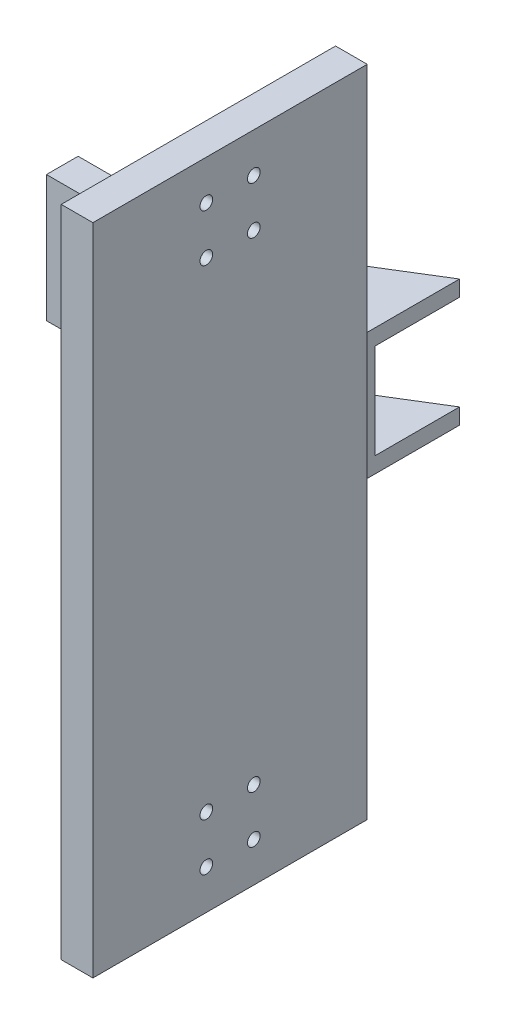
ISO-10303-21;
HEADER;
FILE_DESCRIPTION(('STEP AP214'),'2;1');
FILE_NAME('part.step','',(''),(''),'','','');
FILE_SCHEMA(('AUTOMOTIVE_DESIGN { 1 0 10303 214 1 1 1 1 }'));
ENDSEC;
DATA;
#1=APPLICATION_CONTEXT('core data for automotive mechanical design processes');
#2=APPLICATION_PROTOCOL_DEFINITION('international standard','automotive_design',2000,#1);
#3=PRODUCT_CONTEXT('',#1,'mechanical');
#4=PRODUCT('Part','Part','',(#3));
#5=PRODUCT_RELATED_PRODUCT_CATEGORY('part','',(#4));
#6=PRODUCT_DEFINITION_FORMATION('','',#4);
#7=PRODUCT_DEFINITION_CONTEXT('part definition',#1,'design');
#8=PRODUCT_DEFINITION('design','',#6,#7);
#9=PRODUCT_DEFINITION_SHAPE('','',#8);
#10=(LENGTH_UNIT() NAMED_UNIT(*) SI_UNIT(.MILLI.,.METRE.));
#11=(NAMED_UNIT(*) PLANE_ANGLE_UNIT() SI_UNIT($,.RADIAN.));
#12=(NAMED_UNIT(*) SI_UNIT($,.STERADIAN.) SOLID_ANGLE_UNIT());
#13=UNCERTAINTY_MEASURE_WITH_UNIT(LENGTH_MEASURE(1.E-05),#10,'distance_accuracy_value','');
#14=(GEOMETRIC_REPRESENTATION_CONTEXT(3) GLOBAL_UNCERTAINTY_ASSIGNED_CONTEXT((#13)) GLOBAL_UNIT_ASSIGNED_CONTEXT((#10,
#11,#12)) REPRESENTATION_CONTEXT('',''));
#15=CARTESIAN_POINT('',(0.,0.,0.));
#16=DIRECTION('',(0.,0.,1.));
#17=DIRECTION('',(1.,0.,0.));
#18=AXIS2_PLACEMENT_3D('',#15,#16,#17);
#19=CARTESIAN_POINT('',(0.,0.,-33.5));
#20=DIRECTION('',(0.,0.,-1.));
#21=DIRECTION('',(-1.,0.,0.));
#22=AXIS2_PLACEMENT_3D('',#19,#20,#21);
#23=PLANE('',#22);
#24=CARTESIAN_POINT('',(-118.3,-4.5,-33.5));
#25=DIRECTION('',(0.,0.,-1.));
#26=DIRECTION('',(-1.,0.,0.));
#27=AXIS2_PLACEMENT_3D('',#24,#25,#26);
#28=CIRCLE('',#27,1.19999999999999);
#29=CARTESIAN_POINT('',(-119.5,-4.5,-33.5));
#30=VERTEX_POINT('',#29);
#31=EDGE_CURVE('E198',#30,#30,#28,.T.);
#32=ORIENTED_EDGE('',*,*,#31,.F.);
#33=EDGE_LOOP('',(#32));
#34=FACE_BOUND('',#33,.T.);
#35=CARTESIAN_POINT('',(-118.3,4.5,-33.5));
#36=DIRECTION('',(0.,0.,-1.));
#37=DIRECTION('',(-1.,0.,0.));
#38=AXIS2_PLACEMENT_3D('',#35,#36,#37);
#39=CIRCLE('',#38,1.19999999999999);
#40=CARTESIAN_POINT('',(-119.5,4.5,-33.5));
#41=VERTEX_POINT('',#40);
#42=EDGE_CURVE('E193',#41,#41,#39,.T.);
#43=ORIENTED_EDGE('',*,*,#42,.F.);
#44=EDGE_LOOP('',(#43));
#45=FACE_BOUND('',#44,.T.);
#46=CARTESIAN_POINT('',(-109.3,-4.5,-33.5));
#47=DIRECTION('',(0.,0.,-1.));
#48=DIRECTION('',(-1.,0.,0.));
#49=AXIS2_PLACEMENT_3D('',#46,#47,#48);
#50=CIRCLE('',#49,1.19999999999999);
#51=CARTESIAN_POINT('',(-110.5,-4.5,-33.5));
#52=VERTEX_POINT('',#51);
#53=EDGE_CURVE('E182',#52,#52,#50,.T.);
#54=ORIENTED_EDGE('',*,*,#53,.F.);
#55=EDGE_LOOP('',(#54));
#56=FACE_BOUND('',#55,.T.);
#57=CARTESIAN_POINT('',(-109.3,4.5,-33.5));
#58=DIRECTION('',(0.,0.,-1.));
#59=DIRECTION('',(-1.,0.,0.));
#60=AXIS2_PLACEMENT_3D('',#57,#58,#59);
#61=CIRCLE('',#60,1.19999999999999);
#62=CARTESIAN_POINT('',(-110.5,4.5,-33.5));
#63=VERTEX_POINT('',#62);
#64=EDGE_CURVE('E179',#63,#63,#61,.T.);
#65=ORIENTED_EDGE('',*,*,#64,.F.);
#66=EDGE_LOOP('',(#65));
#67=FACE_BOUND('',#66,.T.);
#68=DIRECTION('',(1.,0.,0.));
#69=VECTOR('',#68,1.);
#70=CARTESIAN_POINT('',(-109.5,-9.,-33.5));
#71=LINE('',#70,#69);
#72=CARTESIAN_POINT('',(-109.5,-9.,-33.5));
#73=VERTEX_POINT('',#72);
#74=CARTESIAN_POINT('',(-83.5,-9.,-33.5));
#75=VERTEX_POINT('',#74);
#76=EDGE_CURVE('E64',#73,#75,#71,.T.);
#77=ORIENTED_EDGE('',*,*,#76,.F.);
#78=DIRECTION('',(0.,-1.,0.));
#79=VECTOR('',#78,1.);
#80=CARTESIAN_POINT('',(-109.5,-9.,-33.5));
#81=LINE('',#80,#79);
#82=CARTESIAN_POINT('',(-109.5,-12.,-33.5));
#83=VERTEX_POINT('',#82);
#84=EDGE_CURVE('E129',#73,#83,#81,.T.);
#85=ORIENTED_EDGE('',*,*,#84,.T.);
#86=DIRECTION('',(1.,0.,0.));
#87=VECTOR('',#86,1.);
#88=CARTESIAN_POINT('',(-139.8,-12.,-33.5));
#89=LINE('',#88,#87);
#90=CARTESIAN_POINT('',(-139.8,-12.,-33.5));
#91=VERTEX_POINT('',#90);
#92=EDGE_CURVE('E167',#91,#83,#89,.T.);
#93=ORIENTED_EDGE('',*,*,#92,.F.);
#94=DIRECTION('',(0.,-1.,0.));
#95=VECTOR('',#94,1.);
#96=CARTESIAN_POINT('',(-139.8,-12.,-33.5));
#97=LINE('',#96,#95);
#98=CARTESIAN_POINT('',(-139.8,12.,-33.5));
#99=VERTEX_POINT('',#98);
#100=EDGE_CURVE('E153',#99,#91,#97,.T.);
#101=ORIENTED_EDGE('',*,*,#100,.F.);
#102=DIRECTION('',(-1.,0.,0.));
#103=VECTOR('',#102,1.);
#104=CARTESIAN_POINT('',(-139.8,12.,-33.5));
#105=LINE('',#104,#103);
#106=CARTESIAN_POINT('',(-109.5,12.,-33.5));
#107=VERTEX_POINT('',#106);
#108=EDGE_CURVE('E158',#107,#99,#105,.T.);
#109=ORIENTED_EDGE('',*,*,#108,.F.);
#110=DIRECTION('',(0.,-1.,0.));
#111=VECTOR('',#110,1.);
#112=CARTESIAN_POINT('',(-109.5,12.,-33.5));
#113=LINE('',#112,#111);
#114=CARTESIAN_POINT('',(-109.5,9.,-33.5));
#115=VERTEX_POINT('',#114);
#116=EDGE_CURVE('E142',#107,#115,#113,.T.);
#117=ORIENTED_EDGE('',*,*,#116,.T.);
#118=DIRECTION('',(1.,0.,0.));
#119=VECTOR('',#118,1.);
#120=CARTESIAN_POINT('',(-109.5,9.,-33.5));
#121=LINE('',#120,#119);
#122=CARTESIAN_POINT('',(-83.5,9.,-33.5));
#123=VERTEX_POINT('',#122);
#124=EDGE_CURVE('E72',#115,#123,#121,.T.);
#125=ORIENTED_EDGE('',*,*,#124,.T.);
#126=DIRECTION('',(0.,1.,0.));
#127=VECTOR('',#126,1.);
#128=CARTESIAN_POINT('',(-83.5,-12.,-33.5));
#129=LINE('',#128,#127);
#130=EDGE_CURVE('E170',#75,#123,#129,.T.);
#131=ORIENTED_EDGE('',*,*,#130,.F.);
#132=EDGE_LOOP('',(#77,#85,#93,#101,#109,#117,#125,#131));
#133=FACE_BOUND('',#132,.T.);
#134=ADVANCED_FACE('F47',(#34,#45,#56,#67,#133),#23,.T.);
#135=CARTESIAN_POINT('',(-139.8,-12.,-27.5));
#136=DIRECTION('',(1.,0.,0.));
#137=DIRECTION('',(0.,0.,-1.));
#138=AXIS2_PLACEMENT_3D('',#135,#136,#137);
#139=PLANE('',#138);
#140=ORIENTED_EDGE('',*,*,#100,.T.);
#141=DIRECTION('',(0.,0.,-1.));
#142=VECTOR('',#141,1.);
#143=CARTESIAN_POINT('',(-139.8,-12.,-27.5));
#144=LINE('',#143,#142);
#145=CARTESIAN_POINT('',(-139.8,-12.,-27.5));
#146=VERTEX_POINT('',#145);
#147=EDGE_CURVE('E12',#146,#91,#144,.T.);
#148=ORIENTED_EDGE('',*,*,#147,.F.);
#149=DIRECTION('',(0.,-1.,0.));
#150=VECTOR('',#149,1.);
#151=CARTESIAN_POINT('',(-139.8,-12.,-27.5));
#152=LINE('',#151,#150);
#153=CARTESIAN_POINT('',(-139.8,12.,-27.5));
#154=VERTEX_POINT('',#153);
#155=EDGE_CURVE('E154',#154,#146,#152,.T.);
#156=ORIENTED_EDGE('',*,*,#155,.F.);
#157=DIRECTION('',(0.,0.,-1.));
#158=VECTOR('',#157,1.);
#159=CARTESIAN_POINT('',(-139.8,12.,-27.5));
#160=LINE('',#159,#158);
#161=EDGE_CURVE('E164',#154,#99,#160,.T.);
#162=ORIENTED_EDGE('',*,*,#161,.T.);
#163=EDGE_LOOP('',(#140,#148,#156,#162));
#164=FACE_BOUND('',#163,.T.);
#165=ADVANCED_FACE('F49',(#164),#139,.F.);
#166=CARTESIAN_POINT('',(-139.8,-12.,-27.5));
#167=DIRECTION('',(0.,1.,0.));
#168=DIRECTION('',(0.,0.,1.));
#169=AXIS2_PLACEMENT_3D('',#166,#167,#168);
#170=PLANE('',#169);
#171=ORIENTED_EDGE('',*,*,#92,.T.);
#172=DIRECTION('',(-0.851658316704544,0.,0.524097425664335));
#173=VECTOR('',#172,1.);
#174=CARTESIAN_POINT('',(-83.5,-12.,-49.5));
#175=LINE('',#174,#173);
#176=CARTESIAN_POINT('',(-83.5,-12.,-49.5));
#177=VERTEX_POINT('',#176);
#178=EDGE_CURVE('E137',#177,#83,#175,.T.);
#179=ORIENTED_EDGE('',*,*,#178,.F.);
#180=DIRECTION('',(0.,0.,-1.));
#181=VECTOR('',#180,1.);
#182=CARTESIAN_POINT('',(-83.5,-12.,-27.5));
#183=LINE('',#182,#181);
#184=CARTESIAN_POINT('',(-83.5,-12.,-27.5));
#185=VERTEX_POINT('',#184);
#186=EDGE_CURVE('E56',#185,#177,#183,.T.);
#187=ORIENTED_EDGE('',*,*,#186,.F.);
#188=DIRECTION('',(1.,0.,0.));
#189=VECTOR('',#188,1.);
#190=CARTESIAN_POINT('',(-139.8,-12.,-27.5));
#191=LINE('',#190,#189);
#192=EDGE_CURVE('E157',#146,#185,#191,.T.);
#193=ORIENTED_EDGE('',*,*,#192,.F.);
#194=ORIENTED_EDGE('',*,*,#147,.T.);
#195=EDGE_LOOP('',(#171,#179,#187,#193,#194));
#196=FACE_BOUND('',#195,.T.);
#197=ADVANCED_FACE('F224',(#196),#170,.F.);
#198=CARTESIAN_POINT('',(-83.5,-12.,-27.5));
#199=DIRECTION('',(-1.,0.,0.));
#200=DIRECTION('',(0.,0.,1.));
#201=AXIS2_PLACEMENT_3D('',#198,#199,#200);
#202=PLANE('',#201);
#203=ORIENTED_EDGE('',*,*,#186,.T.);
#204=DIRECTION('',(0.,-1.,0.));
#205=VECTOR('',#204,1.);
#206=CARTESIAN_POINT('',(-83.5,-9.,-49.5));
#207=LINE('',#206,#205);
#208=CARTESIAN_POINT('',(-83.5,-9.,-49.5));
#209=VERTEX_POINT('',#208);
#210=EDGE_CURVE('E123',#209,#177,#207,.T.);
#211=ORIENTED_EDGE('',*,*,#210,.F.);
#212=DIRECTION('',(0.,0.,-1.));
#213=VECTOR('',#212,1.);
#214=CARTESIAN_POINT('',(-83.5,-9.,-33.5));
#215=LINE('',#214,#213);
#216=EDGE_CURVE('E113',#75,#209,#215,.T.);
#217=ORIENTED_EDGE('',*,*,#216,.F.);
#218=ORIENTED_EDGE('',*,*,#130,.T.);
#219=DIRECTION('',(0.,0.,-1.));
#220=VECTOR('',#219,1.);
#221=CARTESIAN_POINT('',(-83.5,9.,-33.5));
#222=LINE('',#221,#220);
#223=CARTESIAN_POINT('',(-83.5,9.,-49.5));
#224=VERTEX_POINT('',#223);
#225=EDGE_CURVE('E145',#123,#224,#222,.T.);
#226=ORIENTED_EDGE('',*,*,#225,.T.);
#227=DIRECTION('',(0.,-1.,0.));
#228=VECTOR('',#227,1.);
#229=CARTESIAN_POINT('',(-83.5,12.,-49.5));
#230=LINE('',#229,#228);
#231=CARTESIAN_POINT('',(-83.5,12.,-49.5));
#232=VERTEX_POINT('',#231);
#233=EDGE_CURVE('E150',#232,#224,#230,.T.);
#234=ORIENTED_EDGE('',*,*,#233,.F.);
#235=DIRECTION('',(0.,0.,-1.));
#236=VECTOR('',#235,1.);
#237=CARTESIAN_POINT('',(-83.5,12.,-27.5));
#238=LINE('',#237,#236);
#239=CARTESIAN_POINT('',(-83.5,12.,-27.5));
#240=VERTEX_POINT('',#239);
#241=EDGE_CURVE('E175',#240,#232,#238,.T.);
#242=ORIENTED_EDGE('',*,*,#241,.F.);
#243=DIRECTION('',(0.,1.,0.));
#244=VECTOR('',#243,1.);
#245=CARTESIAN_POINT('',(-83.5,-12.,-27.5));
#246=LINE('',#245,#244);
#247=EDGE_CURVE('E160',#185,#240,#246,.T.);
#248=ORIENTED_EDGE('',*,*,#247,.F.);
#249=EDGE_LOOP('',(#203,#211,#217,#218,#226,#234,#242,#248));
#250=FACE_BOUND('',#249,.T.);
#251=ADVANCED_FACE('F124',(#250),#202,.F.);
#252=CARTESIAN_POINT('',(-139.8,12.,-27.5));
#253=DIRECTION('',(0.,-1.,0.));
#254=DIRECTION('',(0.,0.,-1.));
#255=AXIS2_PLACEMENT_3D('',#252,#253,#254);
#256=PLANE('',#255);
#257=ORIENTED_EDGE('',*,*,#241,.T.);
#258=DIRECTION('',(-0.851658316704544,0.,0.524097425664335));
#259=VECTOR('',#258,1.);
#260=CARTESIAN_POINT('',(-83.5,12.,-49.5));
#261=LINE('',#260,#259);
#262=EDGE_CURVE('E140',#232,#107,#261,.T.);
#263=ORIENTED_EDGE('',*,*,#262,.T.);
#264=ORIENTED_EDGE('',*,*,#108,.T.);
#265=ORIENTED_EDGE('',*,*,#161,.F.);
#266=DIRECTION('',(-1.,0.,0.));
#267=VECTOR('',#266,1.);
#268=CARTESIAN_POINT('',(-139.8,12.,-27.5));
#269=LINE('',#268,#267);
#270=EDGE_CURVE('E162',#240,#154,#269,.T.);
#271=ORIENTED_EDGE('',*,*,#270,.F.);
#272=EDGE_LOOP('',(#257,#263,#264,#265,#271));
#273=FACE_BOUND('',#272,.T.);
#274=ADVANCED_FACE('F230',(#273),#256,.F.);
#275=CARTESIAN_POINT('',(0.,0.,-27.5));
#276=DIRECTION('',(0.,0.,-1.));
#277=DIRECTION('',(-1.,0.,0.));
#278=AXIS2_PLACEMENT_3D('',#275,#276,#277);
#279=PLANE('',#278);
#280=CARTESIAN_POINT('',(-118.3,-4.5,-27.5));
#281=DIRECTION('',(0.,0.,-1.));
#282=DIRECTION('',(-1.,0.,0.));
#283=AXIS2_PLACEMENT_3D('',#280,#281,#282);
#284=CIRCLE('',#283,1.19999999999999);
#285=CARTESIAN_POINT('',(-119.5,-4.5,-27.5));
#286=VERTEX_POINT('',#285);
#287=EDGE_CURVE('E51',#286,#286,#284,.T.);
#288=ORIENTED_EDGE('',*,*,#287,.T.);
#289=EDGE_LOOP('',(#288));
#290=FACE_BOUND('',#289,.T.);
#291=CARTESIAN_POINT('',(-118.3,4.5,-27.5));
#292=DIRECTION('',(0.,0.,-1.));
#293=DIRECTION('',(-1.,0.,0.));
#294=AXIS2_PLACEMENT_3D('',#291,#292,#293);
#295=CIRCLE('',#294,1.19999999999999);
#296=CARTESIAN_POINT('',(-119.5,4.5,-27.5));
#297=VERTEX_POINT('',#296);
#298=EDGE_CURVE('E188',#297,#297,#295,.T.);
#299=ORIENTED_EDGE('',*,*,#298,.T.);
#300=EDGE_LOOP('',(#299));
#301=FACE_BOUND('',#300,.T.);
#302=CARTESIAN_POINT('',(-109.3,-4.5,-27.5));
#303=DIRECTION('',(0.,0.,-1.));
#304=DIRECTION('',(-1.,0.,0.));
#305=AXIS2_PLACEMENT_3D('',#302,#303,#304);
#306=CIRCLE('',#305,1.19999999999999);
#307=CARTESIAN_POINT('',(-110.5,-4.5,-27.5));
#308=VERTEX_POINT('',#307);
#309=EDGE_CURVE('E180',#308,#308,#306,.T.);
#310=ORIENTED_EDGE('',*,*,#309,.T.);
#311=EDGE_LOOP('',(#310));
#312=FACE_BOUND('',#311,.T.);
#313=CARTESIAN_POINT('',(-109.3,4.5,-27.5));
#314=DIRECTION('',(0.,0.,-1.));
#315=DIRECTION('',(-1.,0.,0.));
#316=AXIS2_PLACEMENT_3D('',#313,#314,#315);
#317=CIRCLE('',#316,1.19999999999999);
#318=CARTESIAN_POINT('',(-110.5,4.5,-27.5));
#319=VERTEX_POINT('',#318);
#320=EDGE_CURVE('E138',#319,#319,#317,.T.);
#321=ORIENTED_EDGE('',*,*,#320,.T.);
#322=EDGE_LOOP('',(#321));
#323=FACE_BOUND('',#322,.T.);
#324=ORIENTED_EDGE('',*,*,#155,.T.);
#325=ORIENTED_EDGE('',*,*,#192,.T.);
#326=ORIENTED_EDGE('',*,*,#247,.T.);
#327=ORIENTED_EDGE('',*,*,#270,.T.);
#328=EDGE_LOOP('',(#324,#325,#326,#327));
#329=FACE_BOUND('',#328,.T.);
#330=ADVANCED_FACE('F205',(#290,#301,#312,#323,#329),#279,.F.);
#331=CARTESIAN_POINT('',(-83.5,12.,-49.5));
#332=DIRECTION('',(0.524097425664335,0.,0.851658316704544));
#333=DIRECTION('',(0.851658316704544,0.,-0.524097425664335));
#334=AXIS2_PLACEMENT_3D('',#331,#332,#333);
#335=PLANE('',#334);
#336=DIRECTION('',(-0.851658316704544,0.,0.524097425664335));
#337=VECTOR('',#336,1.);
#338=CARTESIAN_POINT('',(-83.5,9.,-49.5));
#339=LINE('',#338,#337);
#340=EDGE_CURVE('E143',#224,#115,#339,.T.);
#341=ORIENTED_EDGE('',*,*,#340,.T.);
#342=ORIENTED_EDGE('',*,*,#116,.F.);
#343=ORIENTED_EDGE('',*,*,#262,.F.);
#344=ORIENTED_EDGE('',*,*,#233,.T.);
#345=EDGE_LOOP('',(#341,#342,#343,#344));
#346=FACE_BOUND('',#345,.T.);
#347=ADVANCED_FACE('F247',(#346),#335,.F.);
#348=CARTESIAN_POINT('',(0.,9.,0.));
#349=DIRECTION('',(0.,1.,0.));
#350=DIRECTION('',(0.,0.,1.));
#351=AXIS2_PLACEMENT_3D('',#348,#349,#350);
#352=PLANE('',#351);
#353=ORIENTED_EDGE('',*,*,#124,.F.);
#354=ORIENTED_EDGE('',*,*,#340,.F.);
#355=ORIENTED_EDGE('',*,*,#225,.F.);
#356=EDGE_LOOP('',(#353,#354,#355));
#357=FACE_BOUND('',#356,.T.);
#358=ADVANCED_FACE('F244',(#357),#352,.F.);
#359=CARTESIAN_POINT('',(-83.5,-9.,-49.5));
#360=DIRECTION('',(0.524097425664335,0.,0.851658316704544));
#361=DIRECTION('',(0.851658316704544,0.,-0.524097425664335));
#362=AXIS2_PLACEMENT_3D('',#359,#360,#361);
#363=PLANE('',#362);
#364=ORIENTED_EDGE('',*,*,#178,.T.);
#365=ORIENTED_EDGE('',*,*,#84,.F.);
#366=DIRECTION('',(-0.851658316704544,0.,0.524097425664335));
#367=VECTOR('',#366,1.);
#368=CARTESIAN_POINT('',(-83.5,-9.,-49.5));
#369=LINE('',#368,#367);
#370=EDGE_CURVE('E117',#209,#73,#369,.T.);
#371=ORIENTED_EDGE('',*,*,#370,.F.);
#372=ORIENTED_EDGE('',*,*,#210,.T.);
#373=EDGE_LOOP('',(#364,#365,#371,#372));
#374=FACE_BOUND('',#373,.T.);
#375=ADVANCED_FACE('F131',(#374),#363,.F.);
#376=CARTESIAN_POINT('',(0.,-9.,0.));
#377=DIRECTION('',(0.,1.,0.));
#378=DIRECTION('',(0.,0.,1.));
#379=AXIS2_PLACEMENT_3D('',#376,#377,#378);
#380=PLANE('',#379);
#381=ORIENTED_EDGE('',*,*,#76,.T.);
#382=ORIENTED_EDGE('',*,*,#216,.T.);
#383=ORIENTED_EDGE('',*,*,#370,.T.);
#384=EDGE_LOOP('',(#381,#382,#383));
#385=FACE_BOUND('',#384,.T.);
#386=ADVANCED_FACE('F115',(#385),#380,.T.);
#387=CARTESIAN_POINT('',(-109.3,4.5,-33.5));
#388=DIRECTION('',(0.,0.,-1.));
#389=DIRECTION('',(-1.,0.,0.));
#390=AXIS2_PLACEMENT_3D('',#387,#388,#389);
#391=CYLINDRICAL_SURFACE('',#390,1.19999999999999);
#392=ORIENTED_EDGE('',*,*,#64,.T.);
#393=EDGE_LOOP('',(#392));
#394=FACE_BOUND('',#393,.T.);
#395=ORIENTED_EDGE('',*,*,#320,.F.);
#396=EDGE_LOOP('',(#395));
#397=FACE_BOUND('',#396,.T.);
#398=ADVANCED_FACE('F267',(#394,#397),#391,.F.);
#399=CARTESIAN_POINT('',(-109.3,-4.5,-33.5));
#400=DIRECTION('',(0.,0.,-1.));
#401=DIRECTION('',(-1.,0.,0.));
#402=AXIS2_PLACEMENT_3D('',#399,#400,#401);
#403=CYLINDRICAL_SURFACE('',#402,1.19999999999999);
#404=ORIENTED_EDGE('',*,*,#53,.T.);
#405=EDGE_LOOP('',(#404));
#406=FACE_BOUND('',#405,.T.);
#407=ORIENTED_EDGE('',*,*,#309,.F.);
#408=EDGE_LOOP('',(#407));
#409=FACE_BOUND('',#408,.T.);
#410=ADVANCED_FACE('F215',(#406,#409),#403,.F.);
#411=CARTESIAN_POINT('',(-118.3,4.5,-33.5));
#412=DIRECTION('',(0.,0.,-1.));
#413=DIRECTION('',(-1.,0.,0.));
#414=AXIS2_PLACEMENT_3D('',#411,#412,#413);
#415=CYLINDRICAL_SURFACE('',#414,1.19999999999999);
#416=ORIENTED_EDGE('',*,*,#42,.T.);
#417=EDGE_LOOP('',(#416));
#418=FACE_BOUND('',#417,.T.);
#419=ORIENTED_EDGE('',*,*,#298,.F.);
#420=EDGE_LOOP('',(#419));
#421=FACE_BOUND('',#420,.T.);
#422=ADVANCED_FACE('F210',(#418,#421),#415,.F.);
#423=CARTESIAN_POINT('',(-118.3,-4.5,-33.5));
#424=DIRECTION('',(0.,0.,-1.));
#425=DIRECTION('',(-1.,0.,0.));
#426=AXIS2_PLACEMENT_3D('',#423,#424,#425);
#427=CYLINDRICAL_SURFACE('',#426,1.19999999999999);
#428=ORIENTED_EDGE('',*,*,#31,.T.);
#429=EDGE_LOOP('',(#428));
#430=FACE_BOUND('',#429,.T.);
#431=ORIENTED_EDGE('',*,*,#287,.F.);
#432=EDGE_LOOP('',(#431));
#433=FACE_BOUND('',#432,.T.);
#434=ADVANCED_FACE('F208',(#430,#433),#427,.F.);
#435=CLOSED_SHELL('',(#134,#165,#197,#251,#274,#330,#347,#358,#375,#386,#398,#410,#422,#434));
#436=MANIFOLD_SOLID_BREP('B2',#435);
#437=CARTESIAN_POINT('',(-77.5,-62.,26.));
#438=DIRECTION('',(0.,0.,-1.));
#439=DIRECTION('',(-1.,0.,0.));
#440=AXIS2_PLACEMENT_3D('',#437,#438,#439);
#441=PLANE('',#440);
#442=DIRECTION('',(0.,-1.,0.));
#443=VECTOR('',#442,1.);
#444=CARTESIAN_POINT('',(-83.5,-62.,26.));
#445=LINE('',#444,#443);
#446=CARTESIAN_POINT('',(-83.5,62.,26.));
#447=VERTEX_POINT('',#446);
#448=CARTESIAN_POINT('',(-83.5,-62.,26.));
#449=VERTEX_POINT('',#448);
#450=EDGE_CURVE('E434',#447,#449,#445,.T.);
#451=ORIENTED_EDGE('',*,*,#450,.T.);
#452=DIRECTION('',(-1.,0.,0.));
#453=VECTOR('',#452,1.);
#454=CARTESIAN_POINT('',(-77.5,-62.,26.));
#455=LINE('',#454,#453);
#456=CARTESIAN_POINT('',(-77.5,-62.,26.));
#457=VERTEX_POINT('',#456);
#458=EDGE_CURVE('E45',#457,#449,#455,.T.);
#459=ORIENTED_EDGE('',*,*,#458,.F.);
#460=DIRECTION('',(0.,-1.,0.));
#461=VECTOR('',#460,1.);
#462=CARTESIAN_POINT('',(-77.5,-62.,26.));
#463=LINE('',#462,#461);
#464=CARTESIAN_POINT('',(-77.5,62.,26.));
#465=VERTEX_POINT('',#464);
#466=EDGE_CURVE('E422',#465,#457,#463,.T.);
#467=ORIENTED_EDGE('',*,*,#466,.F.);
#468=DIRECTION('',(-1.,0.,0.));
#469=VECTOR('',#468,1.);
#470=CARTESIAN_POINT('',(-77.5,62.,26.));
#471=LINE('',#470,#469);
#472=EDGE_CURVE('E430',#465,#447,#471,.T.);
#473=ORIENTED_EDGE('',*,*,#472,.T.);
#474=EDGE_LOOP('',(#451,#459,#467,#473));
#475=FACE_BOUND('',#474,.T.);
#476=ADVANCED_FACE('F371',(#475),#441,.F.);
#477=CARTESIAN_POINT('',(-77.5,-62.,26.));
#478=DIRECTION('',(0.,1.,0.));
#479=DIRECTION('',(0.,0.,1.));
#480=AXIS2_PLACEMENT_3D('',#477,#478,#479);
#481=PLANE('',#480);
#482=DIRECTION('',(0.,0.,-1.));
#483=VECTOR('',#482,1.);
#484=CARTESIAN_POINT('',(-83.5,-62.,26.));
#485=LINE('',#484,#483);
#486=CARTESIAN_POINT('',(-83.5,-62.,-26.));
#487=VERTEX_POINT('',#486);
#488=EDGE_CURVE('E426',#449,#487,#485,.T.);
#489=ORIENTED_EDGE('',*,*,#488,.T.);
#490=DIRECTION('',(-1.,0.,0.));
#491=VECTOR('',#490,1.);
#492=CARTESIAN_POINT('',(-77.5,-62.,-26.));
#493=LINE('',#492,#491);
#494=CARTESIAN_POINT('',(-77.5,-62.,-26.));
#495=VERTEX_POINT('',#494);
#496=EDGE_CURVE('E379',#495,#487,#493,.T.);
#497=ORIENTED_EDGE('',*,*,#496,.F.);
#498=DIRECTION('',(0.,0.,-1.));
#499=VECTOR('',#498,1.);
#500=CARTESIAN_POINT('',(-77.5,-62.,26.));
#501=LINE('',#500,#499);
#502=EDGE_CURVE('E417',#457,#495,#501,.T.);
#503=ORIENTED_EDGE('',*,*,#502,.F.);
#504=ORIENTED_EDGE('',*,*,#458,.T.);
#505=EDGE_LOOP('',(#489,#497,#503,#504));
#506=FACE_BOUND('',#505,.T.);
#507=ADVANCED_FACE('F425',(#506),#481,.F.);
#508=CARTESIAN_POINT('',(-77.5,-62.,-26.));
#509=DIRECTION('',(0.,0.,1.));
#510=DIRECTION('',(1.,0.,0.));
#511=AXIS2_PLACEMENT_3D('',#508,#509,#510);
#512=PLANE('',#511);
#513=DIRECTION('',(0.,1.,0.));
#514=VECTOR('',#513,1.);
#515=CARTESIAN_POINT('',(-83.5,-62.,-26.));
#516=LINE('',#515,#514);
#517=CARTESIAN_POINT('',(-83.5,62.,-26.));
#518=VERTEX_POINT('',#517);
#519=EDGE_CURVE('E404',#487,#518,#516,.T.);
#520=ORIENTED_EDGE('',*,*,#519,.T.);
#521=DIRECTION('',(-1.,0.,0.));
#522=VECTOR('',#521,1.);
#523=CARTESIAN_POINT('',(-77.5,62.,-26.));
#524=LINE('',#523,#522);
#525=CARTESIAN_POINT('',(-77.5,62.,-26.));
#526=VERTEX_POINT('',#525);
#527=EDGE_CURVE('E427',#526,#518,#524,.T.);
#528=ORIENTED_EDGE('',*,*,#527,.F.);
#529=DIRECTION('',(0.,1.,0.));
#530=VECTOR('',#529,1.);
#531=CARTESIAN_POINT('',(-77.5,-62.,-26.));
#532=LINE('',#531,#530);
#533=EDGE_CURVE('E420',#495,#526,#532,.T.);
#534=ORIENTED_EDGE('',*,*,#533,.F.);
#535=ORIENTED_EDGE('',*,*,#496,.T.);
#536=EDGE_LOOP('',(#520,#528,#534,#535));
#537=FACE_BOUND('',#536,.T.);
#538=ADVANCED_FACE('F428',(#537),#512,.F.);
#539=CARTESIAN_POINT('',(-77.5,62.,26.));
#540=DIRECTION('',(0.,-1.,0.));
#541=DIRECTION('',(0.,0.,-1.));
#542=AXIS2_PLACEMENT_3D('',#539,#540,#541);
#543=PLANE('',#542);
#544=DIRECTION('',(0.,0.,1.));
#545=VECTOR('',#544,1.);
#546=CARTESIAN_POINT('',(-83.5,62.,26.));
#547=LINE('',#546,#545);
#548=EDGE_CURVE('E410',#518,#447,#547,.T.);
#549=ORIENTED_EDGE('',*,*,#548,.T.);
#550=ORIENTED_EDGE('',*,*,#472,.F.);
#551=DIRECTION('',(0.,0.,1.));
#552=VECTOR('',#551,1.);
#553=CARTESIAN_POINT('',(-77.5,62.,26.));
#554=LINE('',#553,#552);
#555=EDGE_CURVE('E387',#526,#465,#554,.T.);
#556=ORIENTED_EDGE('',*,*,#555,.F.);
#557=ORIENTED_EDGE('',*,*,#527,.T.);
#558=EDGE_LOOP('',(#549,#550,#556,#557));
#559=FACE_BOUND('',#558,.T.);
#560=ADVANCED_FACE('F442',(#559),#543,.F.);
#561=CARTESIAN_POINT('',(-77.5,0.,0.));
#562=DIRECTION('',(-1.,0.,0.));
#563=DIRECTION('',(0.,0.,1.));
#564=AXIS2_PLACEMENT_3D('',#561,#562,#563);
#565=PLANE('',#564);
#566=CARTESIAN_POINT('',(-77.5,-45.5,4.5));
#567=DIRECTION('',(-1.,0.,0.));
#568=DIRECTION('',(0.,0.,1.));
#569=AXIS2_PLACEMENT_3D('',#566,#567,#568);
#570=CIRCLE('',#569,1.19999999999999);
#571=CARTESIAN_POINT('',(-77.5,-45.5,5.69999999999999));
#572=VERTEX_POINT('',#571);
#573=EDGE_CURVE('E489',#572,#572,#570,.T.);
#574=ORIENTED_EDGE('',*,*,#573,.T.);
#575=EDGE_LOOP('',(#574));
#576=FACE_BOUND('',#575,.T.);
#577=CARTESIAN_POINT('',(-77.5,-45.5,-4.5));
#578=DIRECTION('',(-1.,0.,0.));
#579=DIRECTION('',(0.,0.,1.));
#580=AXIS2_PLACEMENT_3D('',#577,#578,#579);
#581=CIRCLE('',#580,1.19999999999999);
#582=CARTESIAN_POINT('',(-77.5,-45.5,-3.30000000000001));
#583=VERTEX_POINT('',#582);
#584=EDGE_CURVE('E483',#583,#583,#581,.T.);
#585=ORIENTED_EDGE('',*,*,#584,.T.);
#586=EDGE_LOOP('',(#585));
#587=FACE_BOUND('',#586,.T.);
#588=CARTESIAN_POINT('',(-77.5,-54.5,4.5));
#589=DIRECTION('',(-1.,0.,0.));
#590=DIRECTION('',(0.,0.,1.));
#591=AXIS2_PLACEMENT_3D('',#588,#589,#590);
#592=CIRCLE('',#591,1.19999999999999);
#593=CARTESIAN_POINT('',(-77.5,-54.5,5.69999999999999));
#594=VERTEX_POINT('',#593);
#595=EDGE_CURVE('E477',#594,#594,#592,.T.);
#596=ORIENTED_EDGE('',*,*,#595,.T.);
#597=EDGE_LOOP('',(#596));
#598=FACE_BOUND('',#597,.T.);
#599=CARTESIAN_POINT('',(-77.5,-54.5,-4.5));
#600=DIRECTION('',(-1.,0.,0.));
#601=DIRECTION('',(0.,0.,1.));
#602=AXIS2_PLACEMENT_3D('',#599,#600,#601);
#603=CIRCLE('',#602,1.19999999999999);
#604=CARTESIAN_POINT('',(-77.5,-54.5,-3.30000000000001));
#605=VERTEX_POINT('',#604);
#606=EDGE_CURVE('E471',#605,#605,#603,.T.);
#607=ORIENTED_EDGE('',*,*,#606,.T.);
#608=EDGE_LOOP('',(#607));
#609=FACE_BOUND('',#608,.T.);
#610=CARTESIAN_POINT('',(-77.5,54.5,4.5));
#611=DIRECTION('',(-1.,0.,0.));
#612=DIRECTION('',(0.,0.,1.));
#613=AXIS2_PLACEMENT_3D('',#610,#611,#612);
#614=CIRCLE('',#613,1.19999999999999);
#615=CARTESIAN_POINT('',(-77.5,54.5,5.69999999999999));
#616=VERTEX_POINT('',#615);
#617=EDGE_CURVE('E465',#616,#616,#614,.T.);
#618=ORIENTED_EDGE('',*,*,#617,.T.);
#619=EDGE_LOOP('',(#618));
#620=FACE_BOUND('',#619,.T.);
#621=CARTESIAN_POINT('',(-77.5,54.5,-4.5));
#622=DIRECTION('',(-1.,0.,0.));
#623=DIRECTION('',(0.,0.,1.));
#624=AXIS2_PLACEMENT_3D('',#621,#622,#623);
#625=CIRCLE('',#624,1.19999999999999);
#626=CARTESIAN_POINT('',(-77.5,54.5,-3.30000000000001));
#627=VERTEX_POINT('',#626);
#628=EDGE_CURVE('E459',#627,#627,#625,.T.);
#629=ORIENTED_EDGE('',*,*,#628,.T.);
#630=EDGE_LOOP('',(#629));
#631=FACE_BOUND('',#630,.T.);
#632=CARTESIAN_POINT('',(-77.5,45.5,4.5));
#633=DIRECTION('',(-1.,0.,0.));
#634=DIRECTION('',(0.,0.,1.));
#635=AXIS2_PLACEMENT_3D('',#632,#633,#634);
#636=CIRCLE('',#635,1.19999999999999);
#637=CARTESIAN_POINT('',(-77.5,45.5,5.69999999999999));
#638=VERTEX_POINT('',#637);
#639=EDGE_CURVE('E453',#638,#638,#636,.T.);
#640=ORIENTED_EDGE('',*,*,#639,.T.);
#641=EDGE_LOOP('',(#640));
#642=FACE_BOUND('',#641,.T.);
#643=CARTESIAN_POINT('',(-77.5,45.5,-4.5));
#644=DIRECTION('',(-1.,0.,0.));
#645=DIRECTION('',(0.,0.,1.));
#646=AXIS2_PLACEMENT_3D('',#643,#644,#645);
#647=CIRCLE('',#646,1.19999999999999);
#648=CARTESIAN_POINT('',(-77.5,45.5,-3.30000000000001));
#649=VERTEX_POINT('',#648);
#650=EDGE_CURVE('E437',#649,#649,#647,.T.);
#651=ORIENTED_EDGE('',*,*,#650,.T.);
#652=EDGE_LOOP('',(#651));
#653=FACE_BOUND('',#652,.T.);
#654=ORIENTED_EDGE('',*,*,#466,.T.);
#655=ORIENTED_EDGE('',*,*,#502,.T.);
#656=ORIENTED_EDGE('',*,*,#533,.T.);
#657=ORIENTED_EDGE('',*,*,#555,.T.);
#658=EDGE_LOOP('',(#654,#655,#656,#657));
#659=FACE_BOUND('',#658,.T.);
#660=ADVANCED_FACE('F418',(#576,#587,#598,#609,#620,#631,#642,#653,#659),#565,.F.);
#661=CARTESIAN_POINT('',(-83.5,0.,0.));
#662=DIRECTION('',(-1.,0.,0.));
#663=DIRECTION('',(0.,0.,1.));
#664=AXIS2_PLACEMENT_3D('',#661,#662,#663);
#665=PLANE('',#664);
#666=CARTESIAN_POINT('',(-83.5,-45.5,4.5));
#667=DIRECTION('',(-1.,0.,0.));
#668=DIRECTION('',(0.,0.,1.));
#669=AXIS2_PLACEMENT_3D('',#666,#667,#668);
#670=CIRCLE('',#669,1.19999999999999);
#671=CARTESIAN_POINT('',(-83.5,-45.5,5.69999999999999));
#672=VERTEX_POINT('',#671);
#673=EDGE_CURVE('E492',#672,#672,#670,.T.);
#674=ORIENTED_EDGE('',*,*,#673,.F.);
#675=EDGE_LOOP('',(#674));
#676=FACE_BOUND('',#675,.T.);
#677=CARTESIAN_POINT('',(-83.5,-45.5,-4.5));
#678=DIRECTION('',(-1.,0.,0.));
#679=DIRECTION('',(0.,0.,1.));
#680=AXIS2_PLACEMENT_3D('',#677,#678,#679);
#681=CIRCLE('',#680,1.19999999999999);
#682=CARTESIAN_POINT('',(-83.5,-45.5,-3.30000000000001));
#683=VERTEX_POINT('',#682);
#684=EDGE_CURVE('E486',#683,#683,#681,.T.);
#685=ORIENTED_EDGE('',*,*,#684,.F.);
#686=EDGE_LOOP('',(#685));
#687=FACE_BOUND('',#686,.T.);
#688=CARTESIAN_POINT('',(-83.5,-54.5,4.5));
#689=DIRECTION('',(-1.,0.,0.));
#690=DIRECTION('',(0.,0.,1.));
#691=AXIS2_PLACEMENT_3D('',#688,#689,#690);
#692=CIRCLE('',#691,1.19999999999999);
#693=CARTESIAN_POINT('',(-83.5,-54.5,5.69999999999999));
#694=VERTEX_POINT('',#693);
#695=EDGE_CURVE('E480',#694,#694,#692,.T.);
#696=ORIENTED_EDGE('',*,*,#695,.F.);
#697=EDGE_LOOP('',(#696));
#698=FACE_BOUND('',#697,.T.);
#699=CARTESIAN_POINT('',(-83.5,-54.5,-4.5));
#700=DIRECTION('',(-1.,0.,0.));
#701=DIRECTION('',(0.,0.,1.));
#702=AXIS2_PLACEMENT_3D('',#699,#700,#701);
#703=CIRCLE('',#702,1.19999999999999);
#704=CARTESIAN_POINT('',(-83.5,-54.5,-3.30000000000001));
#705=VERTEX_POINT('',#704);
#706=EDGE_CURVE('E474',#705,#705,#703,.T.);
#707=ORIENTED_EDGE('',*,*,#706,.F.);
#708=EDGE_LOOP('',(#707));
#709=FACE_BOUND('',#708,.T.);
#710=CARTESIAN_POINT('',(-83.5,54.5,4.5));
#711=DIRECTION('',(-1.,0.,0.));
#712=DIRECTION('',(0.,0.,1.));
#713=AXIS2_PLACEMENT_3D('',#710,#711,#712);
#714=CIRCLE('',#713,1.19999999999999);
#715=CARTESIAN_POINT('',(-83.5,54.5,5.69999999999999));
#716=VERTEX_POINT('',#715);
#717=EDGE_CURVE('E468',#716,#716,#714,.T.);
#718=ORIENTED_EDGE('',*,*,#717,.F.);
#719=EDGE_LOOP('',(#718));
#720=FACE_BOUND('',#719,.T.);
#721=CARTESIAN_POINT('',(-83.5,54.5,-4.5));
#722=DIRECTION('',(-1.,0.,0.));
#723=DIRECTION('',(0.,0.,1.));
#724=AXIS2_PLACEMENT_3D('',#721,#722,#723);
#725=CIRCLE('',#724,1.19999999999999);
#726=CARTESIAN_POINT('',(-83.5,54.5,-3.30000000000001));
#727=VERTEX_POINT('',#726);
#728=EDGE_CURVE('E462',#727,#727,#725,.T.);
#729=ORIENTED_EDGE('',*,*,#728,.F.);
#730=EDGE_LOOP('',(#729));
#731=FACE_BOUND('',#730,.T.);
#732=CARTESIAN_POINT('',(-83.5,45.5,4.5));
#733=DIRECTION('',(-1.,0.,0.));
#734=DIRECTION('',(0.,0.,1.));
#735=AXIS2_PLACEMENT_3D('',#732,#733,#734);
#736=CIRCLE('',#735,1.19999999999999);
#737=CARTESIAN_POINT('',(-83.5,45.5,5.69999999999999));
#738=VERTEX_POINT('',#737);
#739=EDGE_CURVE('E456',#738,#738,#736,.T.);
#740=ORIENTED_EDGE('',*,*,#739,.F.);
#741=EDGE_LOOP('',(#740));
#742=FACE_BOUND('',#741,.T.);
#743=CARTESIAN_POINT('',(-83.5,45.5,-4.5));
#744=DIRECTION('',(-1.,0.,0.));
#745=DIRECTION('',(0.,0.,1.));
#746=AXIS2_PLACEMENT_3D('',#743,#744,#745);
#747=CIRCLE('',#746,1.19999999999999);
#748=CARTESIAN_POINT('',(-83.5,45.5,-3.30000000000001));
#749=VERTEX_POINT('',#748);
#750=EDGE_CURVE('E450',#749,#749,#747,.T.);
#751=ORIENTED_EDGE('',*,*,#750,.F.);
#752=EDGE_LOOP('',(#751));
#753=FACE_BOUND('',#752,.T.);
#754=ORIENTED_EDGE('',*,*,#450,.F.);
#755=ORIENTED_EDGE('',*,*,#548,.F.);
#756=ORIENTED_EDGE('',*,*,#519,.F.);
#757=ORIENTED_EDGE('',*,*,#488,.F.);
#758=EDGE_LOOP('',(#754,#755,#756,#757));
#759=FACE_BOUND('',#758,.T.);
#760=ADVANCED_FACE('F445',(#676,#687,#698,#709,#720,#731,#742,#753,#759),#665,.T.);
#761=CARTESIAN_POINT('',(-83.5,45.5,-4.5));
#762=DIRECTION('',(-1.,0.,0.));
#763=DIRECTION('',(0.,0.,1.));
#764=AXIS2_PLACEMENT_3D('',#761,#762,#763);
#765=CYLINDRICAL_SURFACE('',#764,1.19999999999999);
#766=ORIENTED_EDGE('',*,*,#650,.F.);
#767=EDGE_LOOP('',(#766));
#768=FACE_BOUND('',#767,.T.);
#769=ORIENTED_EDGE('',*,*,#750,.T.);
#770=EDGE_LOOP('',(#769));
#771=FACE_BOUND('',#770,.T.);
#772=ADVANCED_FACE('F500',(#768,#771),#765,.F.);
#773=CARTESIAN_POINT('',(-83.5,45.5,4.5));
#774=DIRECTION('',(-1.,0.,0.));
#775=DIRECTION('',(0.,0.,1.));
#776=AXIS2_PLACEMENT_3D('',#773,#774,#775);
#777=CYLINDRICAL_SURFACE('',#776,1.19999999999999);
#778=ORIENTED_EDGE('',*,*,#639,.F.);
#779=EDGE_LOOP('',(#778));
#780=FACE_BOUND('',#779,.T.);
#781=ORIENTED_EDGE('',*,*,#739,.T.);
#782=EDGE_LOOP('',(#781));
#783=FACE_BOUND('',#782,.T.);
#784=ADVANCED_FACE('F517',(#780,#783),#777,.F.);
#785=CARTESIAN_POINT('',(-83.5,54.5,-4.5));
#786=DIRECTION('',(-1.,0.,0.));
#787=DIRECTION('',(0.,0.,1.));
#788=AXIS2_PLACEMENT_3D('',#785,#786,#787);
#789=CYLINDRICAL_SURFACE('',#788,1.19999999999999);
#790=ORIENTED_EDGE('',*,*,#628,.F.);
#791=EDGE_LOOP('',(#790));
#792=FACE_BOUND('',#791,.T.);
#793=ORIENTED_EDGE('',*,*,#728,.T.);
#794=EDGE_LOOP('',(#793));
#795=FACE_BOUND('',#794,.T.);
#796=ADVANCED_FACE('F523',(#792,#795),#789,.F.);
#797=CARTESIAN_POINT('',(-83.5,54.5,4.5));
#798=DIRECTION('',(-1.,0.,0.));
#799=DIRECTION('',(0.,0.,1.));
#800=AXIS2_PLACEMENT_3D('',#797,#798,#799);
#801=CYLINDRICAL_SURFACE('',#800,1.19999999999999);
#802=ORIENTED_EDGE('',*,*,#617,.F.);
#803=EDGE_LOOP('',(#802));
#804=FACE_BOUND('',#803,.T.);
#805=ORIENTED_EDGE('',*,*,#717,.T.);
#806=EDGE_LOOP('',(#805));
#807=FACE_BOUND('',#806,.T.);
#808=ADVANCED_FACE('F560',(#804,#807),#801,.F.);
#809=CARTESIAN_POINT('',(-83.5,-54.5,-4.5));
#810=DIRECTION('',(-1.,0.,0.));
#811=DIRECTION('',(0.,0.,1.));
#812=AXIS2_PLACEMENT_3D('',#809,#810,#811);
#813=CYLINDRICAL_SURFACE('',#812,1.19999999999999);
#814=ORIENTED_EDGE('',*,*,#606,.F.);
#815=EDGE_LOOP('',(#814));
#816=FACE_BOUND('',#815,.T.);
#817=ORIENTED_EDGE('',*,*,#706,.T.);
#818=EDGE_LOOP('',(#817));
#819=FACE_BOUND('',#818,.T.);
#820=ADVANCED_FACE('F565',(#816,#819),#813,.F.);
#821=CARTESIAN_POINT('',(-83.5,-54.5,4.5));
#822=DIRECTION('',(-1.,0.,0.));
#823=DIRECTION('',(0.,0.,1.));
#824=AXIS2_PLACEMENT_3D('',#821,#822,#823);
#825=CYLINDRICAL_SURFACE('',#824,1.19999999999999);
#826=ORIENTED_EDGE('',*,*,#595,.F.);
#827=EDGE_LOOP('',(#826));
#828=FACE_BOUND('',#827,.T.);
#829=ORIENTED_EDGE('',*,*,#695,.T.);
#830=EDGE_LOOP('',(#829));
#831=FACE_BOUND('',#830,.T.);
#832=ADVANCED_FACE('F571',(#828,#831),#825,.F.);
#833=CARTESIAN_POINT('',(-83.5,-45.5,-4.5));
#834=DIRECTION('',(-1.,0.,0.));
#835=DIRECTION('',(0.,0.,1.));
#836=AXIS2_PLACEMENT_3D('',#833,#834,#835);
#837=CYLINDRICAL_SURFACE('',#836,1.19999999999999);
#838=ORIENTED_EDGE('',*,*,#584,.F.);
#839=EDGE_LOOP('',(#838));
#840=FACE_BOUND('',#839,.T.);
#841=ORIENTED_EDGE('',*,*,#684,.T.);
#842=EDGE_LOOP('',(#841));
#843=FACE_BOUND('',#842,.T.);
#844=ADVANCED_FACE('F575',(#840,#843),#837,.F.);
#845=CARTESIAN_POINT('',(-83.5,-45.5,4.5));
#846=DIRECTION('',(-1.,0.,0.));
#847=DIRECTION('',(0.,0.,1.));
#848=AXIS2_PLACEMENT_3D('',#845,#846,#847);
#849=CYLINDRICAL_SURFACE('',#848,1.19999999999999);
#850=ORIENTED_EDGE('',*,*,#573,.F.);
#851=EDGE_LOOP('',(#850));
#852=FACE_BOUND('',#851,.T.);
#853=ORIENTED_EDGE('',*,*,#673,.T.);
#854=EDGE_LOOP('',(#853));
#855=FACE_BOUND('',#854,.T.);
#856=ADVANCED_FACE('F496',(#852,#855),#849,.F.);
#857=CLOSED_SHELL('',(#476,#507,#538,#560,#660,#760,#772,#784,#796,#808,#820,#832,#844,#856));
#858=MANIFOLD_SOLID_BREP('B6',#857);
#859=ADVANCED_BREP_SHAPE_REPRESENTATION('',(#18,#436,#858),#14);
#860=SHAPE_DEFINITION_REPRESENTATION(#9,#859);
ENDSEC;
END-ISO-10303-21;
